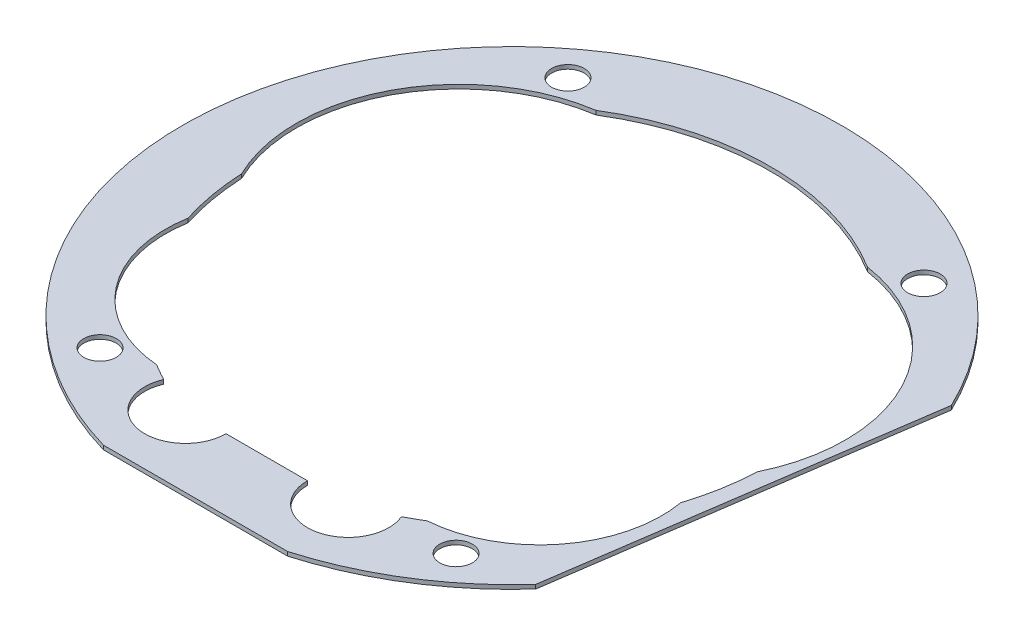
ISO-10303-21;
HEADER;
FILE_DESCRIPTION(('STEP AP214'),'2;1');
FILE_NAME('part.step','',(''),(''),'','','');
FILE_SCHEMA(('AUTOMOTIVE_DESIGN { 1 0 10303 214 1 1 1 1 }'));
ENDSEC;
DATA;
#1=APPLICATION_CONTEXT('core data for automotive mechanical design processes');
#2=APPLICATION_PROTOCOL_DEFINITION('international standard','automotive_design',2000,#1);
#3=PRODUCT_CONTEXT('',#1,'mechanical');
#4=PRODUCT('Part','Part','',(#3));
#5=PRODUCT_RELATED_PRODUCT_CATEGORY('part','',(#4));
#6=PRODUCT_DEFINITION_FORMATION('','',#4);
#7=PRODUCT_DEFINITION_CONTEXT('part definition',#1,'design');
#8=PRODUCT_DEFINITION('design','',#6,#7);
#9=PRODUCT_DEFINITION_SHAPE('','',#8);
#10=(LENGTH_UNIT() NAMED_UNIT(*) SI_UNIT(.MILLI.,.METRE.));
#11=(NAMED_UNIT(*) PLANE_ANGLE_UNIT() SI_UNIT($,.RADIAN.));
#12=(NAMED_UNIT(*) SI_UNIT($,.STERADIAN.) SOLID_ANGLE_UNIT());
#13=UNCERTAINTY_MEASURE_WITH_UNIT(LENGTH_MEASURE(1.E-05),#10,'distance_accuracy_value','');
#14=(GEOMETRIC_REPRESENTATION_CONTEXT(3) GLOBAL_UNCERTAINTY_ASSIGNED_CONTEXT((#13)) GLOBAL_UNIT_ASSIGNED_CONTEXT((#10,
#11,#12)) REPRESENTATION_CONTEXT('',''));
#15=CARTESIAN_POINT('',(0.,0.,0.));
#16=DIRECTION('',(0.,0.,1.));
#17=DIRECTION('',(1.,0.,0.));
#18=AXIS2_PLACEMENT_3D('',#15,#16,#17);
#19=CARTESIAN_POINT('',(0.,0.4,0.));
#20=DIRECTION('',(0.,1.,0.));
#21=DIRECTION('',(0.,0.,1.));
#22=AXIS2_PLACEMENT_3D('',#19,#20,#21);
#23=PLANE('',#22);
#24=CARTESIAN_POINT('',(17.5,0.4,23.));
#25=DIRECTION('',(0.,1.,0.));
#26=DIRECTION('',(0.,0.,1.));
#27=AXIS2_PLACEMENT_3D('',#24,#25,#26);
#28=CIRCLE('',#27,1.6);
#29=CARTESIAN_POINT('',(17.5,0.4,24.6));
#30=VERTEX_POINT('',#29);
#31=EDGE_CURVE('E388',#30,#30,#28,.T.);
#32=ORIENTED_EDGE('',*,*,#31,.F.);
#33=EDGE_LOOP('',(#32));
#34=FACE_BOUND('',#33,.T.);
#35=CARTESIAN_POINT('',(-17.5,0.4,-23.));
#36=DIRECTION('',(0.,1.,0.));
#37=DIRECTION('',(0.,0.,1.));
#38=AXIS2_PLACEMENT_3D('',#35,#36,#37);
#39=CIRCLE('',#38,1.6);
#40=CARTESIAN_POINT('',(-17.5,0.4,-21.4));
#41=VERTEX_POINT('',#40);
#42=EDGE_CURVE('E198',#41,#41,#39,.T.);
#43=ORIENTED_EDGE('',*,*,#42,.F.);
#44=EDGE_LOOP('',(#43));
#45=FACE_BOUND('',#44,.T.);
#46=CARTESIAN_POINT('',(0.,0.4,0.));
#47=DIRECTION('',(0.,1.,0.));
#48=DIRECTION('',(0.,0.,1.));
#49=AXIS2_PLACEMENT_3D('',#46,#47,#48);
#50=CIRCLE('',#49,32.4);
#51=CARTESIAN_POINT('',(29.2378436045863,0.4,-13.9609634822869));
#52=VERTEX_POINT('',#51);
#53=CARTESIAN_POINT('',(-9.06081428788619,0.4,31.1072603171741));
#54=VERTEX_POINT('',#53);
#55=EDGE_CURVE('E248',#52,#54,#50,.T.);
#56=ORIENTED_EDGE('',*,*,#55,.T.);
#57=DIRECTION('',(1.,0.,0.));
#58=VECTOR('',#57,1.);
#59=CARTESIAN_POINT('',(-9.06081428788619,0.4,31.1072603171741));
#60=LINE('',#59,#58);
#61=CARTESIAN_POINT('',(9.06081428788619,0.4,31.1072603171741));
#62=VERTEX_POINT('',#61);
#63=EDGE_CURVE('E251',#54,#62,#60,.T.);
#64=ORIENTED_EDGE('',*,*,#63,.T.);
#65=CARTESIAN_POINT('',(0.,0.4,0.));
#66=DIRECTION('',(0.,1.,0.));
#67=DIRECTION('',(0.,0.,1.));
#68=AXIS2_PLACEMENT_3D('',#65,#66,#67);
#69=CIRCLE('',#68,32.4);
#70=CARTESIAN_POINT('',(24.0490796532106,0.4,21.711788683421));
#71=VERTEX_POINT('',#70);
#72=EDGE_CURVE('E254',#62,#71,#69,.T.);
#73=ORIENTED_EDGE('',*,*,#72,.T.);
#74=DIRECTION('',(0.143939845714111,0.,-0.989586439284511));
#75=VECTOR('',#74,1.);
#76=CARTESIAN_POINT('',(29.2378436045863,0.4,-13.9609634822869));
#77=LINE('',#76,#75);
#78=EDGE_CURVE('E256',#71,#52,#77,.T.);
#79=ORIENTED_EDGE('',*,*,#78,.T.);
#80=EDGE_LOOP('',(#56,#64,#73,#79));
#81=FACE_BOUND('',#80,.T.);
#82=DIRECTION('',(1.,0.,0.));
#83=VECTOR('',#82,1.);
#84=CARTESIAN_POINT('',(-3.99999999999998,0.4,24.1072603171742));
#85=LINE('',#84,#83);
#86=CARTESIAN_POINT('',(-3.99999999999998,0.4,24.1072603171742));
#87=VERTEX_POINT('',#86);
#88=CARTESIAN_POINT('',(3.99999999999999,0.4,24.1072603171742));
#89=VERTEX_POINT('',#88);
#90=EDGE_CURVE('E160',#87,#89,#85,.T.);
#91=ORIENTED_EDGE('',*,*,#90,.F.);
#92=CARTESIAN_POINT('',(-7.99999999999998,0.4,24.1072603171741));
#93=DIRECTION('',(0.,1.,0.));
#94=DIRECTION('',(0.,0.,-1.));
#95=AXIS2_PLACEMENT_3D('',#92,#93,#94);
#96=CIRCLE('',#95,4.);
#97=CARTESIAN_POINT('',(-11.6854315282747,0.4,22.5523987637236));
#98=VERTEX_POINT('',#97);
#99=EDGE_CURVE('E152',#98,#87,#96,.T.);
#100=ORIENTED_EDGE('',*,*,#99,.F.);
#101=CARTESIAN_POINT('',(0.,0.4,0.));
#102=DIRECTION('',(0.,1.,0.));
#103=DIRECTION('',(0.,0.,1.));
#104=AXIS2_PLACEMENT_3D('',#101,#102,#103);
#105=CIRCLE('',#104,25.4);
#106=CARTESIAN_POINT('',(-13.2978530984018,0.4,21.6408665023683));
#107=VERTEX_POINT('',#106);
#108=EDGE_CURVE('E195',#107,#98,#105,.T.);
#109=ORIENTED_EDGE('',*,*,#108,.F.);
#110=CARTESIAN_POINT('',(-12.3998406999061,0.4,9.67451477211449));
#111=DIRECTION('',(0.,1.,0.));
#112=DIRECTION('',(0.,0.,1.));
#113=AXIS2_PLACEMENT_3D('',#110,#111,#112);
#114=CIRCLE('',#113,12.);
#115=CARTESIAN_POINT('',(-24.2252815045124,0.4,7.6351644400843));
#116=VERTEX_POINT('',#115);
#117=EDGE_CURVE('E193',#116,#107,#114,.T.);
#118=ORIENTED_EDGE('',*,*,#117,.F.);
#119=CARTESIAN_POINT('',(0.,0.4,0.));
#120=DIRECTION('',(0.,1.,0.));
#121=DIRECTION('',(0.,0.,1.));
#122=AXIS2_PLACEMENT_3D('',#119,#120,#121);
#123=CIRCLE('',#122,25.4);
#124=CARTESIAN_POINT('',(-25.3711035277439,0.4,1.21124142288015));
#125=VERTEX_POINT('',#124);
#126=EDGE_CURVE('E191',#125,#116,#123,.T.);
#127=ORIENTED_EDGE('',*,*,#126,.F.);
#128=CARTESIAN_POINT('',(-10.9821857515515,0.4,-5.78583262488977));
#129=DIRECTION('',(0.,1.,0.));
#130=DIRECTION('',(0.,0.,-1.));
#131=AXIS2_PLACEMENT_3D('',#128,#129,#130);
#132=CIRCLE('',#131,16.);
#133=CARTESIAN_POINT('',(-13.3480316216226,0.4,-21.6099526105025));
#134=VERTEX_POINT('',#133);
#135=EDGE_CURVE('E189',#134,#125,#132,.T.);
#136=ORIENTED_EDGE('',*,*,#135,.F.);
#137=CARTESIAN_POINT('',(0.,0.4,0.));
#138=DIRECTION('',(0.,1.,0.));
#139=DIRECTION('',(0.,0.,1.));
#140=AXIS2_PLACEMENT_3D('',#137,#138,#139);
#141=CIRCLE('',#140,25.4);
#142=CARTESIAN_POINT('',(13.3480316216226,0.4,-21.6099526105025));
#143=VERTEX_POINT('',#142);
#144=EDGE_CURVE('E187',#143,#134,#141,.T.);
#145=ORIENTED_EDGE('',*,*,#144,.F.);
#146=CARTESIAN_POINT('',(10.9821857515515,0.4,-5.78583262488976));
#147=DIRECTION('',(0.,1.,0.));
#148=DIRECTION('',(0.,0.,-1.));
#149=AXIS2_PLACEMENT_3D('',#146,#147,#148);
#150=CIRCLE('',#149,16.);
#151=CARTESIAN_POINT('',(25.3711035277439,0.4,1.21124142288016));
#152=VERTEX_POINT('',#151);
#153=EDGE_CURVE('E185',#152,#143,#150,.T.);
#154=ORIENTED_EDGE('',*,*,#153,.F.);
#155=CARTESIAN_POINT('',(0.,0.4,0.));
#156=DIRECTION('',(0.,1.,0.));
#157=DIRECTION('',(0.,0.,1.));
#158=AXIS2_PLACEMENT_3D('',#155,#156,#157);
#159=CIRCLE('',#158,25.4);
#160=CARTESIAN_POINT('',(24.2252815045124,0.4,7.6351644400843));
#161=VERTEX_POINT('',#160);
#162=EDGE_CURVE('E183',#161,#152,#159,.T.);
#163=ORIENTED_EDGE('',*,*,#162,.F.);
#164=CARTESIAN_POINT('',(12.3998406999061,0.4,9.6745147721145));
#165=DIRECTION('',(0.,1.,0.));
#166=DIRECTION('',(0.,0.,1.));
#167=AXIS2_PLACEMENT_3D('',#164,#165,#166);
#168=CIRCLE('',#167,12.);
#169=CARTESIAN_POINT('',(13.2978530984018,0.4,21.6408665023683));
#170=VERTEX_POINT('',#169);
#171=EDGE_CURVE('E181',#170,#161,#168,.T.);
#172=ORIENTED_EDGE('',*,*,#171,.F.);
#173=CARTESIAN_POINT('',(0.,0.4,0.));
#174=DIRECTION('',(0.,1.,0.));
#175=DIRECTION('',(0.,0.,1.));
#176=AXIS2_PLACEMENT_3D('',#173,#174,#175);
#177=CIRCLE('',#176,25.4);
#178=CARTESIAN_POINT('',(11.6854315282747,0.4,22.5523987637236));
#179=VERTEX_POINT('',#178);
#180=EDGE_CURVE('E176',#179,#170,#177,.T.);
#181=ORIENTED_EDGE('',*,*,#180,.F.);
#182=CARTESIAN_POINT('',(7.99999999999999,0.4,24.1072603171742));
#183=DIRECTION('',(0.,1.,0.));
#184=DIRECTION('',(0.,0.,1.));
#185=AXIS2_PLACEMENT_3D('',#182,#183,#184);
#186=CIRCLE('',#185,4.);
#187=EDGE_CURVE('E174',#89,#179,#186,.T.);
#188=ORIENTED_EDGE('',*,*,#187,.F.);
#189=EDGE_LOOP('',(#91,#100,#109,#118,#127,#136,#145,#154,#163,#172,#181,#188));
#190=FACE_BOUND('',#189,.T.);
#191=CARTESIAN_POINT('',(-17.5,0.4,23.));
#192=DIRECTION('',(0.,1.,0.));
#193=DIRECTION('',(0.,0.,1.));
#194=AXIS2_PLACEMENT_3D('',#191,#192,#193);
#195=CIRCLE('',#194,1.6);
#196=CARTESIAN_POINT('',(-17.5,0.4,24.6));
#197=VERTEX_POINT('',#196);
#198=EDGE_CURVE('E394',#197,#197,#195,.T.);
#199=ORIENTED_EDGE('',*,*,#198,.F.);
#200=EDGE_LOOP('',(#199));
#201=FACE_BOUND('',#200,.T.);
#202=CARTESIAN_POINT('',(17.5,0.4,-23.));
#203=DIRECTION('',(0.,1.,0.));
#204=DIRECTION('',(0.,0.,1.));
#205=AXIS2_PLACEMENT_3D('',#202,#203,#204);
#206=CIRCLE('',#205,1.6);
#207=CARTESIAN_POINT('',(17.5,0.4,-21.4));
#208=VERTEX_POINT('',#207);
#209=EDGE_CURVE('E379',#208,#208,#206,.T.);
#210=ORIENTED_EDGE('',*,*,#209,.F.);
#211=EDGE_LOOP('',(#210));
#212=FACE_BOUND('',#211,.T.);
#213=ADVANCED_FACE('F39',(#34,#45,#81,#190,#201,#212),#23,.T.);
#214=CARTESIAN_POINT('',(0.,0.,0.));
#215=DIRECTION('',(0.,1.,0.));
#216=DIRECTION('',(0.,0.,1.));
#217=AXIS2_PLACEMENT_3D('',#214,#215,#216);
#218=PLANE('',#217);
#219=CARTESIAN_POINT('',(0.,0.,0.));
#220=DIRECTION('',(0.,1.,0.));
#221=DIRECTION('',(0.,0.,1.));
#222=AXIS2_PLACEMENT_3D('',#219,#220,#221);
#223=CIRCLE('',#222,32.4);
#224=CARTESIAN_POINT('',(29.2378436045863,0.,-13.9609634822869));
#225=VERTEX_POINT('',#224);
#226=CARTESIAN_POINT('',(-9.06081428788619,0.,31.1072603171741));
#227=VERTEX_POINT('',#226);
#228=EDGE_CURVE('E168',#225,#227,#223,.T.);
#229=ORIENTED_EDGE('',*,*,#228,.F.);
#230=DIRECTION('',(0.143939845714111,0.,-0.989586439284511));
#231=VECTOR('',#230,1.);
#232=CARTESIAN_POINT('',(29.2378436045863,0.,-13.9609634822869));
#233=LINE('',#232,#231);
#234=CARTESIAN_POINT('',(24.0490796532106,0.,21.711788683421));
#235=VERTEX_POINT('',#234);
#236=EDGE_CURVE('E252',#235,#225,#233,.T.);
#237=ORIENTED_EDGE('',*,*,#236,.F.);
#238=CARTESIAN_POINT('',(0.,0.,0.));
#239=DIRECTION('',(0.,1.,0.));
#240=DIRECTION('',(0.,0.,1.));
#241=AXIS2_PLACEMENT_3D('',#238,#239,#240);
#242=CIRCLE('',#241,32.4);
#243=CARTESIAN_POINT('',(9.06081428788619,0.,31.1072603171741));
#244=VERTEX_POINT('',#243);
#245=EDGE_CURVE('E263',#244,#235,#242,.T.);
#246=ORIENTED_EDGE('',*,*,#245,.F.);
#247=DIRECTION('',(1.,0.,0.));
#248=VECTOR('',#247,1.);
#249=CARTESIAN_POINT('',(-9.06081428788619,0.,31.1072603171741));
#250=LINE('',#249,#248);
#251=EDGE_CURVE('E261',#227,#244,#250,.T.);
#252=ORIENTED_EDGE('',*,*,#251,.F.);
#253=EDGE_LOOP('',(#229,#237,#246,#252));
#254=FACE_BOUND('',#253,.T.);
#255=CARTESIAN_POINT('',(-7.99999999999998,0.,24.1072603171741));
#256=DIRECTION('',(0.,1.,0.));
#257=DIRECTION('',(0.,0.,-1.));
#258=AXIS2_PLACEMENT_3D('',#255,#256,#257);
#259=CIRCLE('',#258,4.);
#260=CARTESIAN_POINT('',(-11.6854315282747,0.,22.5523987637236));
#261=VERTEX_POINT('',#260);
#262=CARTESIAN_POINT('',(-3.99999999999998,0.,24.1072603171742));
#263=VERTEX_POINT('',#262);
#264=EDGE_CURVE('E62',#261,#263,#259,.T.);
#265=ORIENTED_EDGE('',*,*,#264,.T.);
#266=DIRECTION('',(1.,0.,0.));
#267=VECTOR('',#266,1.);
#268=CARTESIAN_POINT('',(-3.99999999999998,0.,24.1072603171742));
#269=LINE('',#268,#267);
#270=CARTESIAN_POINT('',(3.99999999999999,0.,24.1072603171742));
#271=VERTEX_POINT('',#270);
#272=EDGE_CURVE('E167',#263,#271,#269,.T.);
#273=ORIENTED_EDGE('',*,*,#272,.T.);
#274=CARTESIAN_POINT('',(7.99999999999999,0.,24.1072603171742));
#275=DIRECTION('',(0.,1.,0.));
#276=DIRECTION('',(0.,0.,1.));
#277=AXIS2_PLACEMENT_3D('',#274,#275,#276);
#278=CIRCLE('',#277,4.);
#279=CARTESIAN_POINT('',(11.6854315282747,0.,22.5523987637236));
#280=VERTEX_POINT('',#279);
#281=EDGE_CURVE('E200',#271,#280,#278,.T.);
#282=ORIENTED_EDGE('',*,*,#281,.T.);
#283=CARTESIAN_POINT('',(0.,0.,0.));
#284=DIRECTION('',(0.,1.,0.));
#285=DIRECTION('',(0.,0.,1.));
#286=AXIS2_PLACEMENT_3D('',#283,#284,#285);
#287=CIRCLE('',#286,25.4);
#288=CARTESIAN_POINT('',(13.2978530984018,0.,21.6408665023683));
#289=VERTEX_POINT('',#288);
#290=EDGE_CURVE('E203',#280,#289,#287,.T.);
#291=ORIENTED_EDGE('',*,*,#290,.T.);
#292=CARTESIAN_POINT('',(12.3998406999061,0.,9.6745147721145));
#293=DIRECTION('',(0.,1.,0.));
#294=DIRECTION('',(0.,0.,1.));
#295=AXIS2_PLACEMENT_3D('',#292,#293,#294);
#296=CIRCLE('',#295,12.);
#297=CARTESIAN_POINT('',(24.2252815045124,0.,7.6351644400843));
#298=VERTEX_POINT('',#297);
#299=EDGE_CURVE('E206',#289,#298,#296,.T.);
#300=ORIENTED_EDGE('',*,*,#299,.T.);
#301=CARTESIAN_POINT('',(0.,0.,0.));
#302=DIRECTION('',(0.,1.,0.));
#303=DIRECTION('',(0.,0.,1.));
#304=AXIS2_PLACEMENT_3D('',#301,#302,#303);
#305=CIRCLE('',#304,25.4);
#306=CARTESIAN_POINT('',(25.3711035277439,0.,1.21124142288016));
#307=VERTEX_POINT('',#306);
#308=EDGE_CURVE('E209',#298,#307,#305,.T.);
#309=ORIENTED_EDGE('',*,*,#308,.T.);
#310=CARTESIAN_POINT('',(10.9821857515515,0.,-5.78583262488976));
#311=DIRECTION('',(0.,1.,0.));
#312=DIRECTION('',(0.,0.,-1.));
#313=AXIS2_PLACEMENT_3D('',#310,#311,#312);
#314=CIRCLE('',#313,16.);
#315=CARTESIAN_POINT('',(13.3480316216226,0.,-21.6099526105025));
#316=VERTEX_POINT('',#315);
#317=EDGE_CURVE('E212',#307,#316,#314,.T.);
#318=ORIENTED_EDGE('',*,*,#317,.T.);
#319=CARTESIAN_POINT('',(0.,0.,0.));
#320=DIRECTION('',(0.,1.,0.));
#321=DIRECTION('',(0.,0.,1.));
#322=AXIS2_PLACEMENT_3D('',#319,#320,#321);
#323=CIRCLE('',#322,25.4);
#324=CARTESIAN_POINT('',(-13.3480316216226,0.,-21.6099526105025));
#325=VERTEX_POINT('',#324);
#326=EDGE_CURVE('E215',#316,#325,#323,.T.);
#327=ORIENTED_EDGE('',*,*,#326,.T.);
#328=CARTESIAN_POINT('',(-10.9821857515515,0.,-5.78583262488977));
#329=DIRECTION('',(0.,1.,0.));
#330=DIRECTION('',(0.,0.,-1.));
#331=AXIS2_PLACEMENT_3D('',#328,#329,#330);
#332=CIRCLE('',#331,16.);
#333=CARTESIAN_POINT('',(-25.3711035277439,0.,1.21124142288015));
#334=VERTEX_POINT('',#333);
#335=EDGE_CURVE('E218',#325,#334,#332,.T.);
#336=ORIENTED_EDGE('',*,*,#335,.T.);
#337=CARTESIAN_POINT('',(0.,0.,0.));
#338=DIRECTION('',(0.,1.,0.));
#339=DIRECTION('',(0.,0.,1.));
#340=AXIS2_PLACEMENT_3D('',#337,#338,#339);
#341=CIRCLE('',#340,25.4);
#342=CARTESIAN_POINT('',(-24.2252815045124,0.,7.6351644400843));
#343=VERTEX_POINT('',#342);
#344=EDGE_CURVE('E221',#334,#343,#341,.T.);
#345=ORIENTED_EDGE('',*,*,#344,.T.);
#346=CARTESIAN_POINT('',(-12.3998406999061,0.,9.67451477211449));
#347=DIRECTION('',(0.,1.,0.));
#348=DIRECTION('',(0.,0.,1.));
#349=AXIS2_PLACEMENT_3D('',#346,#347,#348);
#350=CIRCLE('',#349,12.);
#351=CARTESIAN_POINT('',(-13.2978530984018,0.,21.6408665023683));
#352=VERTEX_POINT('',#351);
#353=EDGE_CURVE('E224',#343,#352,#350,.T.);
#354=ORIENTED_EDGE('',*,*,#353,.T.);
#355=CARTESIAN_POINT('',(0.,0.,0.));
#356=DIRECTION('',(0.,1.,0.));
#357=DIRECTION('',(0.,0.,1.));
#358=AXIS2_PLACEMENT_3D('',#355,#356,#357);
#359=CIRCLE('',#358,25.4);
#360=EDGE_CURVE('E161',#352,#261,#359,.T.);
#361=ORIENTED_EDGE('',*,*,#360,.T.);
#362=EDGE_LOOP('',(#265,#273,#282,#291,#300,#309,#318,#327,#336,#345,#354,#361));
#363=FACE_BOUND('',#362,.T.);
#364=CARTESIAN_POINT('',(-17.5,0.,-23.));
#365=DIRECTION('',(0.,1.,0.));
#366=DIRECTION('',(0.,0.,1.));
#367=AXIS2_PLACEMENT_3D('',#364,#365,#366);
#368=CIRCLE('',#367,1.6);
#369=CARTESIAN_POINT('',(-17.5,0.,-21.4));
#370=VERTEX_POINT('',#369);
#371=EDGE_CURVE('E397',#370,#370,#368,.T.);
#372=ORIENTED_EDGE('',*,*,#371,.T.);
#373=EDGE_LOOP('',(#372));
#374=FACE_BOUND('',#373,.T.);
#375=CARTESIAN_POINT('',(-17.5,0.,23.));
#376=DIRECTION('',(0.,1.,0.));
#377=DIRECTION('',(0.,0.,1.));
#378=AXIS2_PLACEMENT_3D('',#375,#376,#377);
#379=CIRCLE('',#378,1.6);
#380=CARTESIAN_POINT('',(-17.5,0.,24.6));
#381=VERTEX_POINT('',#380);
#382=EDGE_CURVE('E391',#381,#381,#379,.T.);
#383=ORIENTED_EDGE('',*,*,#382,.T.);
#384=EDGE_LOOP('',(#383));
#385=FACE_BOUND('',#384,.T.);
#386=CARTESIAN_POINT('',(17.5,0.,23.));
#387=DIRECTION('',(0.,1.,0.));
#388=DIRECTION('',(0.,0.,1.));
#389=AXIS2_PLACEMENT_3D('',#386,#387,#388);
#390=CIRCLE('',#389,1.6);
#391=CARTESIAN_POINT('',(17.5,0.,24.6));
#392=VERTEX_POINT('',#391);
#393=EDGE_CURVE('E385',#392,#392,#390,.T.);
#394=ORIENTED_EDGE('',*,*,#393,.T.);
#395=EDGE_LOOP('',(#394));
#396=FACE_BOUND('',#395,.T.);
#397=CARTESIAN_POINT('',(17.5,0.,-23.));
#398=DIRECTION('',(0.,1.,0.));
#399=DIRECTION('',(0.,0.,1.));
#400=AXIS2_PLACEMENT_3D('',#397,#398,#399);
#401=CIRCLE('',#400,1.6);
#402=CARTESIAN_POINT('',(17.5,0.,-21.4));
#403=VERTEX_POINT('',#402);
#404=EDGE_CURVE('E382',#403,#403,#401,.T.);
#405=ORIENTED_EDGE('',*,*,#404,.T.);
#406=EDGE_LOOP('',(#405));
#407=FACE_BOUND('',#406,.T.);
#408=ADVANCED_FACE('F281',(#254,#363,#374,#385,#396,#407),#218,.F.);
#409=CARTESIAN_POINT('',(0.,0.4,0.));
#410=DIRECTION('',(0.,-1.,0.));
#411=DIRECTION('',(0.,0.,-1.));
#412=AXIS2_PLACEMENT_3D('',#409,#410,#411);
#413=CYLINDRICAL_SURFACE('',#412,32.4);
#414=ORIENTED_EDGE('',*,*,#228,.T.);
#415=DIRECTION('',(0.,-1.,0.));
#416=VECTOR('',#415,1.);
#417=CARTESIAN_POINT('',(-9.06081428788619,0.4,31.1072603171741));
#418=LINE('',#417,#416);
#419=EDGE_CURVE('E11',#54,#227,#418,.T.);
#420=ORIENTED_EDGE('',*,*,#419,.F.);
#421=ORIENTED_EDGE('',*,*,#55,.F.);
#422=DIRECTION('',(0.,-1.,0.));
#423=VECTOR('',#422,1.);
#424=CARTESIAN_POINT('',(29.2378436045863,0.4,-13.9609634822869));
#425=LINE('',#424,#423);
#426=EDGE_CURVE('E258',#52,#225,#425,.T.);
#427=ORIENTED_EDGE('',*,*,#426,.T.);
#428=EDGE_LOOP('',(#414,#420,#421,#427));
#429=FACE_BOUND('',#428,.T.);
#430=ADVANCED_FACE('F41',(#429),#413,.T.);
#431=CARTESIAN_POINT('',(-9.06081428788619,0.4,31.1072603171741));
#432=DIRECTION('',(0.,0.,-1.));
#433=DIRECTION('',(-1.,0.,0.));
#434=AXIS2_PLACEMENT_3D('',#431,#432,#433);
#435=PLANE('',#434);
#436=ORIENTED_EDGE('',*,*,#251,.T.);
#437=DIRECTION('',(0.,-1.,0.));
#438=VECTOR('',#437,1.);
#439=CARTESIAN_POINT('',(9.06081428788619,0.4,31.1072603171741));
#440=LINE('',#439,#438);
#441=EDGE_CURVE('E47',#62,#244,#440,.T.);
#442=ORIENTED_EDGE('',*,*,#441,.F.);
#443=ORIENTED_EDGE('',*,*,#63,.F.);
#444=ORIENTED_EDGE('',*,*,#419,.T.);
#445=EDGE_LOOP('',(#436,#442,#443,#444));
#446=FACE_BOUND('',#445,.T.);
#447=ADVANCED_FACE('F291',(#446),#435,.F.);
#448=CARTESIAN_POINT('',(0.,0.4,0.));
#449=DIRECTION('',(0.,-1.,0.));
#450=DIRECTION('',(0.,0.,-1.));
#451=AXIS2_PLACEMENT_3D('',#448,#449,#450);
#452=CYLINDRICAL_SURFACE('',#451,32.4);
#453=ORIENTED_EDGE('',*,*,#245,.T.);
#454=DIRECTION('',(0.,-1.,0.));
#455=VECTOR('',#454,1.);
#456=CARTESIAN_POINT('',(24.0490796532106,0.4,21.711788683421));
#457=LINE('',#456,#455);
#458=EDGE_CURVE('E268',#71,#235,#457,.T.);
#459=ORIENTED_EDGE('',*,*,#458,.F.);
#460=ORIENTED_EDGE('',*,*,#72,.F.);
#461=ORIENTED_EDGE('',*,*,#441,.T.);
#462=EDGE_LOOP('',(#453,#459,#460,#461));
#463=FACE_BOUND('',#462,.T.);
#464=ADVANCED_FACE('F275',(#463),#452,.T.);
#465=CARTESIAN_POINT('',(29.2378436045863,0.4,-13.9609634822869));
#466=DIRECTION('',(-0.989586439284511,0.,-0.143939845714111));
#467=DIRECTION('',(-0.143939845714111,0.,0.989586439284511));
#468=AXIS2_PLACEMENT_3D('',#465,#466,#467);
#469=PLANE('',#468);
#470=ORIENTED_EDGE('',*,*,#236,.T.);
#471=ORIENTED_EDGE('',*,*,#426,.F.);
#472=ORIENTED_EDGE('',*,*,#78,.F.);
#473=ORIENTED_EDGE('',*,*,#458,.T.);
#474=EDGE_LOOP('',(#470,#471,#472,#473));
#475=FACE_BOUND('',#474,.T.);
#476=ADVANCED_FACE('F285',(#475),#469,.F.);
#477=CARTESIAN_POINT('',(-7.99999999999998,0.4,24.1072603171741));
#478=DIRECTION('',(0.,-1.,0.));
#479=DIRECTION('',(0.,0.,-1.));
#480=AXIS2_PLACEMENT_3D('',#477,#478,#479);
#481=CYLINDRICAL_SURFACE('',#480,4.);
#482=ORIENTED_EDGE('',*,*,#264,.F.);
#483=DIRECTION('',(0.,-1.,0.));
#484=VECTOR('',#483,1.);
#485=CARTESIAN_POINT('',(-11.6854315282747,0.4,22.5523987637236));
#486=LINE('',#485,#484);
#487=EDGE_CURVE('E156',#98,#261,#486,.T.);
#488=ORIENTED_EDGE('',*,*,#487,.F.);
#489=ORIENTED_EDGE('',*,*,#99,.T.);
#490=DIRECTION('',(0.,-1.,0.));
#491=VECTOR('',#490,1.);
#492=CARTESIAN_POINT('',(-3.99999999999998,0.4,24.1072603171742));
#493=LINE('',#492,#491);
#494=EDGE_CURVE('E155',#87,#263,#493,.T.);
#495=ORIENTED_EDGE('',*,*,#494,.T.);
#496=EDGE_LOOP('',(#482,#488,#489,#495));
#497=FACE_BOUND('',#496,.T.);
#498=ADVANCED_FACE('F154',(#497),#481,.F.);
#499=CARTESIAN_POINT('',(-3.99999999999998,0.4,24.1072603171742));
#500=DIRECTION('',(0.,0.,-1.));
#501=DIRECTION('',(-1.,0.,0.));
#502=AXIS2_PLACEMENT_3D('',#499,#500,#501);
#503=PLANE('',#502);
#504=ORIENTED_EDGE('',*,*,#272,.F.);
#505=ORIENTED_EDGE('',*,*,#494,.F.);
#506=ORIENTED_EDGE('',*,*,#90,.T.);
#507=DIRECTION('',(0.,-1.,0.));
#508=VECTOR('',#507,1.);
#509=CARTESIAN_POINT('',(3.99999999999999,0.4,24.1072603171742));
#510=LINE('',#509,#508);
#511=EDGE_CURVE('E169',#89,#271,#510,.T.);
#512=ORIENTED_EDGE('',*,*,#511,.T.);
#513=EDGE_LOOP('',(#504,#505,#506,#512));
#514=FACE_BOUND('',#513,.T.);
#515=ADVANCED_FACE('F164',(#514),#503,.T.);
#516=CARTESIAN_POINT('',(7.99999999999999,0.4,24.1072603171742));
#517=DIRECTION('',(0.,-1.,0.));
#518=DIRECTION('',(0.,0.,-1.));
#519=AXIS2_PLACEMENT_3D('',#516,#517,#518);
#520=CYLINDRICAL_SURFACE('',#519,4.);
#521=ORIENTED_EDGE('',*,*,#281,.F.);
#522=ORIENTED_EDGE('',*,*,#511,.F.);
#523=ORIENTED_EDGE('',*,*,#187,.T.);
#524=DIRECTION('',(0.,-1.,0.));
#525=VECTOR('',#524,1.);
#526=CARTESIAN_POINT('',(11.6854315282747,0.4,22.5523987637236));
#527=LINE('',#526,#525);
#528=EDGE_CURVE('E245',#179,#280,#527,.T.);
#529=ORIENTED_EDGE('',*,*,#528,.T.);
#530=EDGE_LOOP('',(#521,#522,#523,#529));
#531=FACE_BOUND('',#530,.T.);
#532=ADVANCED_FACE('F317',(#531),#520,.F.);
#533=CARTESIAN_POINT('',(0.,0.4,0.));
#534=DIRECTION('',(0.,-1.,0.));
#535=DIRECTION('',(0.,0.,-1.));
#536=AXIS2_PLACEMENT_3D('',#533,#534,#535);
#537=CYLINDRICAL_SURFACE('',#536,25.4);
#538=ORIENTED_EDGE('',*,*,#290,.F.);
#539=ORIENTED_EDGE('',*,*,#528,.F.);
#540=ORIENTED_EDGE('',*,*,#180,.T.);
#541=DIRECTION('',(0.,-1.,0.));
#542=VECTOR('',#541,1.);
#543=CARTESIAN_POINT('',(13.2978530984018,0.4,21.6408665023683));
#544=LINE('',#543,#542);
#545=EDGE_CURVE('E243',#170,#289,#544,.T.);
#546=ORIENTED_EDGE('',*,*,#545,.T.);
#547=EDGE_LOOP('',(#538,#539,#540,#546));
#548=FACE_BOUND('',#547,.T.);
#549=ADVANCED_FACE('F321',(#548),#537,.F.);
#550=CARTESIAN_POINT('',(12.3998406999061,0.4,9.6745147721145));
#551=DIRECTION('',(0.,-1.,0.));
#552=DIRECTION('',(0.,0.,-1.));
#553=AXIS2_PLACEMENT_3D('',#550,#551,#552);
#554=CYLINDRICAL_SURFACE('',#553,12.);
#555=ORIENTED_EDGE('',*,*,#299,.F.);
#556=ORIENTED_EDGE('',*,*,#545,.F.);
#557=ORIENTED_EDGE('',*,*,#171,.T.);
#558=DIRECTION('',(0.,-1.,0.));
#559=VECTOR('',#558,1.);
#560=CARTESIAN_POINT('',(24.2252815045124,0.4,7.6351644400843));
#561=LINE('',#560,#559);
#562=EDGE_CURVE('E241',#161,#298,#561,.T.);
#563=ORIENTED_EDGE('',*,*,#562,.T.);
#564=EDGE_LOOP('',(#555,#556,#557,#563));
#565=FACE_BOUND('',#564,.T.);
#566=ADVANCED_FACE('F327',(#565),#554,.F.);
#567=CARTESIAN_POINT('',(0.,0.4,0.));
#568=DIRECTION('',(0.,-1.,0.));
#569=DIRECTION('',(0.,0.,-1.));
#570=AXIS2_PLACEMENT_3D('',#567,#568,#569);
#571=CYLINDRICAL_SURFACE('',#570,25.4);
#572=ORIENTED_EDGE('',*,*,#308,.F.);
#573=ORIENTED_EDGE('',*,*,#562,.F.);
#574=ORIENTED_EDGE('',*,*,#162,.T.);
#575=DIRECTION('',(0.,-1.,0.));
#576=VECTOR('',#575,1.);
#577=CARTESIAN_POINT('',(25.3711035277439,0.4,1.21124142288016));
#578=LINE('',#577,#576);
#579=EDGE_CURVE('E239',#152,#307,#578,.T.);
#580=ORIENTED_EDGE('',*,*,#579,.T.);
#581=EDGE_LOOP('',(#572,#573,#574,#580));
#582=FACE_BOUND('',#581,.T.);
#583=ADVANCED_FACE('F331',(#582),#571,.F.);
#584=CARTESIAN_POINT('',(10.9821857515515,0.4,-5.78583262488976));
#585=DIRECTION('',(0.,-1.,0.));
#586=DIRECTION('',(0.,0.,-1.));
#587=AXIS2_PLACEMENT_3D('',#584,#585,#586);
#588=CYLINDRICAL_SURFACE('',#587,16.);
#589=ORIENTED_EDGE('',*,*,#317,.F.);
#590=ORIENTED_EDGE('',*,*,#579,.F.);
#591=ORIENTED_EDGE('',*,*,#153,.T.);
#592=DIRECTION('',(0.,-1.,0.));
#593=VECTOR('',#592,1.);
#594=CARTESIAN_POINT('',(13.3480316216226,0.4,-21.6099526105025));
#595=LINE('',#594,#593);
#596=EDGE_CURVE('E237',#143,#316,#595,.T.);
#597=ORIENTED_EDGE('',*,*,#596,.T.);
#598=EDGE_LOOP('',(#589,#590,#591,#597));
#599=FACE_BOUND('',#598,.T.);
#600=ADVANCED_FACE('F335',(#599),#588,.F.);
#601=CARTESIAN_POINT('',(0.,0.4,0.));
#602=DIRECTION('',(0.,-1.,0.));
#603=DIRECTION('',(0.,0.,-1.));
#604=AXIS2_PLACEMENT_3D('',#601,#602,#603);
#605=CYLINDRICAL_SURFACE('',#604,25.4);
#606=ORIENTED_EDGE('',*,*,#326,.F.);
#607=ORIENTED_EDGE('',*,*,#596,.F.);
#608=ORIENTED_EDGE('',*,*,#144,.T.);
#609=DIRECTION('',(0.,-1.,0.));
#610=VECTOR('',#609,1.);
#611=CARTESIAN_POINT('',(-13.3480316216226,0.4,-21.6099526105025));
#612=LINE('',#611,#610);
#613=EDGE_CURVE('E235',#134,#325,#612,.T.);
#614=ORIENTED_EDGE('',*,*,#613,.T.);
#615=EDGE_LOOP('',(#606,#607,#608,#614));
#616=FACE_BOUND('',#615,.T.);
#617=ADVANCED_FACE('F339',(#616),#605,.F.);
#618=CARTESIAN_POINT('',(-10.9821857515515,0.4,-5.78583262488977));
#619=DIRECTION('',(0.,-1.,0.));
#620=DIRECTION('',(0.,0.,-1.));
#621=AXIS2_PLACEMENT_3D('',#618,#619,#620);
#622=CYLINDRICAL_SURFACE('',#621,16.);
#623=ORIENTED_EDGE('',*,*,#335,.F.);
#624=ORIENTED_EDGE('',*,*,#613,.F.);
#625=ORIENTED_EDGE('',*,*,#135,.T.);
#626=DIRECTION('',(0.,-1.,0.));
#627=VECTOR('',#626,1.);
#628=CARTESIAN_POINT('',(-25.3711035277439,0.4,1.21124142288015));
#629=LINE('',#628,#627);
#630=EDGE_CURVE('E233',#125,#334,#629,.T.);
#631=ORIENTED_EDGE('',*,*,#630,.T.);
#632=EDGE_LOOP('',(#623,#624,#625,#631));
#633=FACE_BOUND('',#632,.T.);
#634=ADVANCED_FACE('F343',(#633),#622,.F.);
#635=CARTESIAN_POINT('',(0.,0.4,0.));
#636=DIRECTION('',(0.,-1.,0.));
#637=DIRECTION('',(0.,0.,-1.));
#638=AXIS2_PLACEMENT_3D('',#635,#636,#637);
#639=CYLINDRICAL_SURFACE('',#638,25.4);
#640=ORIENTED_EDGE('',*,*,#344,.F.);
#641=ORIENTED_EDGE('',*,*,#630,.F.);
#642=ORIENTED_EDGE('',*,*,#126,.T.);
#643=DIRECTION('',(0.,-1.,0.));
#644=VECTOR('',#643,1.);
#645=CARTESIAN_POINT('',(-24.2252815045124,0.4,7.6351644400843));
#646=LINE('',#645,#644);
#647=EDGE_CURVE('E231',#116,#343,#646,.T.);
#648=ORIENTED_EDGE('',*,*,#647,.T.);
#649=EDGE_LOOP('',(#640,#641,#642,#648));
#650=FACE_BOUND('',#649,.T.);
#651=ADVANCED_FACE('F347',(#650),#639,.F.);
#652=CARTESIAN_POINT('',(-12.3998406999061,0.4,9.67451477211449));
#653=DIRECTION('',(0.,-1.,0.));
#654=DIRECTION('',(0.,0.,-1.));
#655=AXIS2_PLACEMENT_3D('',#652,#653,#654);
#656=CYLINDRICAL_SURFACE('',#655,12.);
#657=ORIENTED_EDGE('',*,*,#353,.F.);
#658=ORIENTED_EDGE('',*,*,#647,.F.);
#659=ORIENTED_EDGE('',*,*,#117,.T.);
#660=DIRECTION('',(0.,-1.,0.));
#661=VECTOR('',#660,1.);
#662=CARTESIAN_POINT('',(-13.2978530984018,0.4,21.6408665023683));
#663=LINE('',#662,#661);
#664=EDGE_CURVE('E54',#107,#352,#663,.T.);
#665=ORIENTED_EDGE('',*,*,#664,.T.);
#666=EDGE_LOOP('',(#657,#658,#659,#665));
#667=FACE_BOUND('',#666,.T.);
#668=ADVANCED_FACE('F351',(#667),#656,.F.);
#669=CARTESIAN_POINT('',(0.,0.4,0.));
#670=DIRECTION('',(0.,-1.,0.));
#671=DIRECTION('',(0.,0.,-1.));
#672=AXIS2_PLACEMENT_3D('',#669,#670,#671);
#673=CYLINDRICAL_SURFACE('',#672,25.4);
#674=ORIENTED_EDGE('',*,*,#360,.F.);
#675=ORIENTED_EDGE('',*,*,#664,.F.);
#676=ORIENTED_EDGE('',*,*,#108,.T.);
#677=ORIENTED_EDGE('',*,*,#487,.T.);
#678=EDGE_LOOP('',(#674,#675,#676,#677));
#679=FACE_BOUND('',#678,.T.);
#680=ADVANCED_FACE('F355',(#679),#673,.F.);
#681=CARTESIAN_POINT('',(-17.5,0.4,-23.));
#682=DIRECTION('',(0.,-1.,0.));
#683=DIRECTION('',(0.,0.,-1.));
#684=AXIS2_PLACEMENT_3D('',#681,#682,#683);
#685=CYLINDRICAL_SURFACE('',#684,1.6);
#686=ORIENTED_EDGE('',*,*,#42,.T.);
#687=EDGE_LOOP('',(#686));
#688=FACE_BOUND('',#687,.T.);
#689=ORIENTED_EDGE('',*,*,#371,.F.);
#690=EDGE_LOOP('',(#689));
#691=FACE_BOUND('',#690,.T.);
#692=ADVANCED_FACE('F359',(#688,#691),#685,.F.);
#693=CARTESIAN_POINT('',(-17.5,0.4,23.));
#694=DIRECTION('',(0.,-1.,0.));
#695=DIRECTION('',(0.,0.,-1.));
#696=AXIS2_PLACEMENT_3D('',#693,#694,#695);
#697=CYLINDRICAL_SURFACE('',#696,1.6);
#698=ORIENTED_EDGE('',*,*,#198,.T.);
#699=EDGE_LOOP('',(#698));
#700=FACE_BOUND('',#699,.T.);
#701=ORIENTED_EDGE('',*,*,#382,.F.);
#702=EDGE_LOOP('',(#701));
#703=FACE_BOUND('',#702,.T.);
#704=ADVANCED_FACE('F362',(#700,#703),#697,.F.);
#705=CARTESIAN_POINT('',(17.5,0.4,23.));
#706=DIRECTION('',(0.,-1.,0.));
#707=DIRECTION('',(0.,0.,-1.));
#708=AXIS2_PLACEMENT_3D('',#705,#706,#707);
#709=CYLINDRICAL_SURFACE('',#708,1.6);
#710=ORIENTED_EDGE('',*,*,#31,.T.);
#711=EDGE_LOOP('',(#710));
#712=FACE_BOUND('',#711,.T.);
#713=ORIENTED_EDGE('',*,*,#393,.F.);
#714=EDGE_LOOP('',(#713));
#715=FACE_BOUND('',#714,.T.);
#716=ADVANCED_FACE('F366',(#712,#715),#709,.F.);
#717=CARTESIAN_POINT('',(17.5,0.4,-23.));
#718=DIRECTION('',(0.,-1.,0.));
#719=DIRECTION('',(0.,0.,-1.));
#720=AXIS2_PLACEMENT_3D('',#717,#718,#719);
#721=CYLINDRICAL_SURFACE('',#720,1.6);
#722=ORIENTED_EDGE('',*,*,#209,.T.);
#723=EDGE_LOOP('',(#722));
#724=FACE_BOUND('',#723,.T.);
#725=ORIENTED_EDGE('',*,*,#404,.F.);
#726=EDGE_LOOP('',(#725));
#727=FACE_BOUND('',#726,.T.);
#728=ADVANCED_FACE('F370',(#724,#727),#721,.F.);
#729=CLOSED_SHELL('',(#213,#408,#430,#447,#464,#476,#498,#515,#532,#549,#566,#583,#600,#617,
#634,#651,#668,#680,#692,#704,#716,#728));
#730=MANIFOLD_SOLID_BREP('B2',#729);
#731=ADVANCED_BREP_SHAPE_REPRESENTATION('',(#18,#730),#14);
#732=SHAPE_DEFINITION_REPRESENTATION(#9,#731);
ENDSEC;
END-ISO-10303-21;
